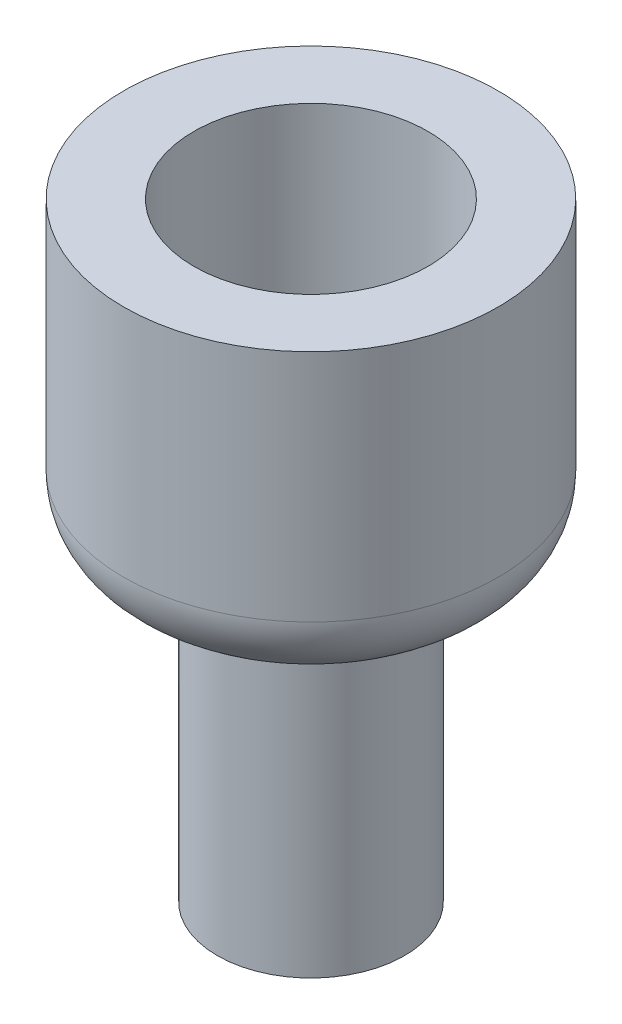
ISO-10303-21;
HEADER;
FILE_DESCRIPTION(('STEP AP214'),'2;1');
FILE_NAME('part.step','',(''),(''),'','','');
FILE_SCHEMA(('AUTOMOTIVE_DESIGN { 1 0 10303 214 1 1 1 1 }'));
ENDSEC;
DATA;
#1=APPLICATION_CONTEXT('core data for automotive mechanical design processes');
#2=APPLICATION_PROTOCOL_DEFINITION('international standard','automotive_design',2000,#1);
#3=PRODUCT_CONTEXT('',#1,'mechanical');
#4=PRODUCT('Part','Part','',(#3));
#5=PRODUCT_RELATED_PRODUCT_CATEGORY('part','',(#4));
#6=PRODUCT_DEFINITION_FORMATION('','',#4);
#7=PRODUCT_DEFINITION_CONTEXT('part definition',#1,'design');
#8=PRODUCT_DEFINITION('design','',#6,#7);
#9=PRODUCT_DEFINITION_SHAPE('','',#8);
#10=(LENGTH_UNIT() NAMED_UNIT(*) SI_UNIT(.MILLI.,.METRE.));
#11=(NAMED_UNIT(*) PLANE_ANGLE_UNIT() SI_UNIT($,.RADIAN.));
#12=(NAMED_UNIT(*) SI_UNIT($,.STERADIAN.) SOLID_ANGLE_UNIT());
#13=UNCERTAINTY_MEASURE_WITH_UNIT(LENGTH_MEASURE(1.E-05),#10,'distance_accuracy_value','');
#14=(GEOMETRIC_REPRESENTATION_CONTEXT(3) GLOBAL_UNCERTAINTY_ASSIGNED_CONTEXT((#13)) GLOBAL_UNIT_ASSIGNED_CONTEXT((#10,
#11,#12)) REPRESENTATION_CONTEXT('',''));
#15=CARTESIAN_POINT('',(0.,0.,0.));
#16=DIRECTION('',(0.,0.,1.));
#17=DIRECTION('',(1.,0.,0.));
#18=AXIS2_PLACEMENT_3D('',#15,#16,#17);
#19=CARTESIAN_POINT('',(0.,0.,0.));
#20=DIRECTION('',(0.,1.,0.));
#21=DIRECTION('',(0.,0.,1.));
#22=AXIS2_PLACEMENT_3D('',#19,#20,#21);
#23=CYLINDRICAL_SURFACE('',#22,2.);
#24=CARTESIAN_POINT('',(0.,-6.5,0.));
#25=DIRECTION('',(0.,1.,0.));
#26=DIRECTION('',(0.,0.,1.));
#27=AXIS2_PLACEMENT_3D('',#24,#25,#26);
#28=CIRCLE('',#27,2.);
#29=CARTESIAN_POINT('',(0.,-6.5,2.));
#30=VERTEX_POINT('',#29);
#31=EDGE_CURVE('E10',#30,#30,#28,.T.);
#32=ORIENTED_EDGE('',*,*,#31,.T.);
#33=EDGE_LOOP('',(#32));
#34=FACE_BOUND('',#33,.T.);
#35=CARTESIAN_POINT('',(0.,0.,0.));
#36=DIRECTION('',(0.,1.,0.));
#37=DIRECTION('',(0.,0.,1.));
#38=AXIS2_PLACEMENT_3D('',#35,#36,#37);
#39=CIRCLE('',#38,2.);
#40=CARTESIAN_POINT('',(0.,0.,2.));
#41=VERTEX_POINT('',#40);
#42=EDGE_CURVE('E65',#41,#41,#39,.T.);
#43=ORIENTED_EDGE('',*,*,#42,.F.);
#44=EDGE_LOOP('',(#43));
#45=FACE_BOUND('',#44,.T.);
#46=ADVANCED_FACE('F34',(#34,#45),#23,.T.);
#47=CARTESIAN_POINT('',(-2.,-6.5,0.));
#48=DIRECTION('',(0.,-1.,0.));
#49=DIRECTION('',(0.,0.,-1.));
#50=AXIS2_PLACEMENT_3D('',#47,#48,#49);
#51=PLANE('',#50);
#52=CARTESIAN_POINT('',(0.,-6.5,0.));
#53=DIRECTION('',(0.,1.,0.));
#54=DIRECTION('',(0.,0.,1.));
#55=AXIS2_PLACEMENT_3D('',#52,#53,#54);
#56=CIRCLE('',#55,0.749999999999999);
#57=CARTESIAN_POINT('',(0.,-6.5,0.749999999999999));
#58=VERTEX_POINT('',#57);
#59=EDGE_CURVE('E40',#58,#58,#56,.T.);
#60=ORIENTED_EDGE('',*,*,#59,.T.);
#61=EDGE_LOOP('',(#60));
#62=FACE_BOUND('',#61,.T.);
#63=ORIENTED_EDGE('',*,*,#31,.F.);
#64=EDGE_LOOP('',(#63));
#65=FACE_BOUND('',#64,.T.);
#66=ADVANCED_FACE('F73',(#62,#65),#51,.T.);
#67=CARTESIAN_POINT('',(0.,0.,0.));
#68=DIRECTION('',(0.,1.,0.));
#69=DIRECTION('',(0.,0.,1.));
#70=AXIS2_PLACEMENT_3D('',#67,#68,#69);
#71=CYLINDRICAL_SURFACE('',#70,0.749999999999999);
#72=CARTESIAN_POINT('',(0.,1.5,0.));
#73=DIRECTION('',(0.,1.,0.));
#74=DIRECTION('',(0.,0.,1.));
#75=AXIS2_PLACEMENT_3D('',#72,#73,#74);
#76=CIRCLE('',#75,0.749999999999999);
#77=CARTESIAN_POINT('',(0.,1.5,0.749999999999999));
#78=VERTEX_POINT('',#77);
#79=EDGE_CURVE('E44',#78,#78,#76,.T.);
#80=ORIENTED_EDGE('',*,*,#79,.T.);
#81=EDGE_LOOP('',(#80));
#82=FACE_BOUND('',#81,.T.);
#83=ORIENTED_EDGE('',*,*,#59,.F.);
#84=EDGE_LOOP('',(#83));
#85=FACE_BOUND('',#84,.T.);
#86=ADVANCED_FACE('F77',(#82,#85),#71,.F.);
#87=CARTESIAN_POINT('',(0.,1.5,0.));
#88=DIRECTION('',(0.,1.,0.));
#89=DIRECTION('',(0.,0.,1.));
#90=AXIS2_PLACEMENT_3D('',#87,#88,#89);
#91=CONICAL_SURFACE('',#90,0.749999999999999,1.0471975511966);
#92=CARTESIAN_POINT('',(0.,2.51036297108185,0.));
#93=DIRECTION('',(0.,1.,0.));
#94=DIRECTION('',(0.,0.,1.));
#95=AXIS2_PLACEMENT_3D('',#92,#93,#94);
#96=CIRCLE('',#95,2.5);
#97=CARTESIAN_POINT('',(0.,2.51036297108185,2.5));
#98=VERTEX_POINT('',#97);
#99=EDGE_CURVE('E48',#98,#98,#96,.T.);
#100=CARTESIAN_POINT('',(0.,2.51036297108185,2.5));
#101=CARTESIAN_POINT('',(0.,2.49983835679974,2.48177083333333));
#102=CARTESIAN_POINT('',(0.,2.48931374251764,2.46354166666667));
#103=CARTESIAN_POINT('',(0.,2.46826451395344,2.42708333333333));
#104=CARTESIAN_POINT('',(0.,2.45773989967133,2.40885416666667));
#105=CARTESIAN_POINT('',(0.,2.43669067110713,2.37239583333333));
#106=CARTESIAN_POINT('',(0.,2.42616605682503,2.35416666666667));
#107=CARTESIAN_POINT('',(0.,2.40511682826082,2.31770833333333));
#108=CARTESIAN_POINT('',(0.,2.39459221397872,2.29947916666667));
#109=CARTESIAN_POINT('',(0.,2.37354298541451,2.26302083333333));
#110=CARTESIAN_POINT('',(0.,2.36301837113241,2.24479166666667));
#111=CARTESIAN_POINT('',(0.,2.34196914256821,2.20833333333333));
#112=CARTESIAN_POINT('',(0.,2.3314445282861,2.19010416666667));
#113=CARTESIAN_POINT('',(0.,2.3103952997219,2.15364583333333));
#114=CARTESIAN_POINT('',(0.,2.2998706854398,2.13541666666667));
#115=CARTESIAN_POINT('',(0.,2.27882145687559,2.09895833333333));
#116=CARTESIAN_POINT('',(0.,2.26829684259349,2.08072916666667));
#117=CARTESIAN_POINT('',(0.,2.24724761402928,2.04427083333333));
#118=CARTESIAN_POINT('',(0.,2.23672299974718,2.02604166666667));
#119=CARTESIAN_POINT('',(0.,2.21567377118297,1.98958333333333));
#120=CARTESIAN_POINT('',(0.,2.20514915690087,1.97135416666667));
#121=CARTESIAN_POINT('',(0.,2.18409992833667,1.93489583333333));
#122=CARTESIAN_POINT('',(0.,2.17357531405456,1.91666666666667));
#123=CARTESIAN_POINT('',(0.,2.15252608549036,1.88020833333333));
#124=CARTESIAN_POINT('',(0.,2.14200147120826,1.86197916666667));
#125=CARTESIAN_POINT('',(0.,2.12095224264405,1.82552083333333));
#126=CARTESIAN_POINT('',(0.,2.11042762836195,1.80729166666667));
#127=CARTESIAN_POINT('',(0.,2.08937839979774,1.77083333333333));
#128=CARTESIAN_POINT('',(0.,2.07885378551564,1.75260416666667));
#129=CARTESIAN_POINT('',(0.,2.05780455695144,1.71614583333333));
#130=CARTESIAN_POINT('',(0.,2.04727994266933,1.69791666666667));
#131=CARTESIAN_POINT('',(0.,2.02623071410513,1.66145833333333));
#132=CARTESIAN_POINT('',(0.,2.01570609982303,1.64322916666667));
#133=CARTESIAN_POINT('',(0.,1.99465687125882,1.60677083333333));
#134=CARTESIAN_POINT('',(0.,1.98413225697672,1.58854166666667));
#135=CARTESIAN_POINT('',(0.,1.96308302841251,1.55208333333333));
#136=CARTESIAN_POINT('',(0.,1.95255841413041,1.53385416666667));
#137=CARTESIAN_POINT('',(0.,1.9315091855662,1.49739583333333));
#138=CARTESIAN_POINT('',(0.,1.9209845712841,1.47916666666667));
#139=CARTESIAN_POINT('',(0.,1.8999353427199,1.44270833333333));
#140=CARTESIAN_POINT('',(0.,1.88941072843779,1.42447916666667));
#141=CARTESIAN_POINT('',(0.,1.86836149987359,1.38802083333333));
#142=CARTESIAN_POINT('',(0.,1.85783688559149,1.36979166666667));
#143=CARTESIAN_POINT('',(0.,1.83678765702728,1.33333333333333));
#144=CARTESIAN_POINT('',(0.,1.82626304274518,1.31510416666667));
#145=CARTESIAN_POINT('',(0.,1.80521381418097,1.27864583333333));
#146=CARTESIAN_POINT('',(0.,1.79468919989887,1.26041666666667));
#147=CARTESIAN_POINT('',(0.,1.77363997133467,1.22395833333333));
#148=CARTESIAN_POINT('',(0.,1.76311535705256,1.20572916666667));
#149=CARTESIAN_POINT('',(0.,1.74206612848836,1.16927083333333));
#150=CARTESIAN_POINT('',(0.,1.73154151420626,1.15104166666667));
#151=CARTESIAN_POINT('',(0.,1.71049228564205,1.11458333333333));
#152=CARTESIAN_POINT('',(0.,1.69996767135995,1.09635416666667));
#153=CARTESIAN_POINT('',(0.,1.67891844279574,1.05989583333333));
#154=CARTESIAN_POINT('',(0.,1.66839382851364,1.04166666666667));
#155=CARTESIAN_POINT('',(0.,1.64734459994944,1.00520833333333));
#156=CARTESIAN_POINT('',(0.,1.63681998566733,0.986979166666666));
#157=CARTESIAN_POINT('',(0.,1.61577075710313,0.950520833333333));
#158=CARTESIAN_POINT('',(0.,1.60524614282102,0.932291666666666));
#159=CARTESIAN_POINT('',(0.,1.58419691425682,0.895833333333333));
#160=CARTESIAN_POINT('',(0.,1.57367229997472,0.877604166666666));
#161=CARTESIAN_POINT('',(0.,1.55262307141051,0.841145833333333));
#162=CARTESIAN_POINT('',(0.,1.54209845712841,0.822916666666666));
#163=CARTESIAN_POINT('',(0.,1.5210492285642,0.786458333333333));
#164=CARTESIAN_POINT('',(0.,1.5105246142821,0.768229166666666));
#165=CARTESIAN_POINT('',(0.,1.5,0.749999999999999));
#166=B_SPLINE_CURVE_WITH_KNOTS('',3,(#100,#101,#102,#103,#104,#105,#106,#107,#108,#109,#110,
#111,#112,#113,#114,#115,#116,#117,#118,#119,#120,#121,#122,#123,#124,#125,#126,#127,#128,#129,
#130,#131,#132,#133,#134,#135,#136,#137,#138,#139,#140,#141,#142,#143,#144,#145,#146,#147,#148,
#149,#150,#151,#152,#153,#154,#155,#156,#157,#158,#159,#160,#161,#162,#163,#164,#165),
.UNSPECIFIED.,.F.,.F.,(4,2,2,2,2,2,2,2,2,2,2,2,2,2,2,2,2,2,2,2,2,2,2,2,2,2,2,2,2,2,2,2,4),(0.,
0.0631476856926155,0.126295371385231,0.189443057077846,0.252590742770462,0.315738428463077,
0.378886114155692,0.442033799848308,0.505181485540923,0.568329171233538,0.631476856926154,
0.694624542618769,0.757772228311384,0.820919914004,0.884067599696615,0.94721528538923,
1.01036297108185,1.07351065677446,1.13665834246708,1.19980602815969,1.26295371385231,
1.32610139954492,1.38924908523754,1.45239677093015,1.51554445662277,1.57869214231538,
1.641839828008,1.70498751370062,1.76813519939323,1.83128288508585,1.89443057077846,
1.95757825647108,2.02072594216369),.UNSPECIFIED.);
#167=EDGE_CURVE('BSEAM81',#98,#78,#166,.T.);
#168=ORIENTED_EDGE('',*,*,#99,.T.);
#169=ORIENTED_EDGE('',*,*,#79,.F.);
#170=ORIENTED_EDGE('',*,*,#167,.T.);
#171=ORIENTED_EDGE('',*,*,#167,.F.);
#172=EDGE_LOOP('',(#168,#170,#169,#171));
#173=FACE_BOUND('',#172,.T.);
#174=ADVANCED_FACE('F81',(#173),#91,.F.);
#175=CARTESIAN_POINT('',(0.,0.,0.));
#176=DIRECTION('',(0.,1.,0.));
#177=DIRECTION('',(0.,0.,1.));
#178=AXIS2_PLACEMENT_3D('',#175,#176,#177);
#179=CYLINDRICAL_SURFACE('',#178,2.5);
#180=CARTESIAN_POINT('',(0.,6.5,0.));
#181=DIRECTION('',(0.,1.,0.));
#182=DIRECTION('',(0.,0.,1.));
#183=AXIS2_PLACEMENT_3D('',#180,#181,#182);
#184=CIRCLE('',#183,2.5);
#185=CARTESIAN_POINT('',(0.,6.5,2.5));
#186=VERTEX_POINT('',#185);
#187=EDGE_CURVE('E53',#186,#186,#184,.T.);
#188=ORIENTED_EDGE('',*,*,#187,.T.);
#189=EDGE_LOOP('',(#188));
#190=FACE_BOUND('',#189,.T.);
#191=ORIENTED_EDGE('',*,*,#99,.F.);
#192=EDGE_LOOP('',(#191));
#193=FACE_BOUND('',#192,.T.);
#194=ADVANCED_FACE('F88',(#190,#193),#179,.F.);
#195=CARTESIAN_POINT('',(-2.5,6.5,0.));
#196=DIRECTION('',(0.,1.,0.));
#197=DIRECTION('',(0.,0.,1.));
#198=AXIS2_PLACEMENT_3D('',#195,#196,#197);
#199=PLANE('',#198);
#200=CARTESIAN_POINT('',(0.,6.5,0.));
#201=DIRECTION('',(0.,1.,0.));
#202=DIRECTION('',(0.,0.,1.));
#203=AXIS2_PLACEMENT_3D('',#200,#201,#202);
#204=CIRCLE('',#203,4.);
#205=CARTESIAN_POINT('',(0.,6.5,4.));
#206=VERTEX_POINT('',#205);
#207=EDGE_CURVE('E56',#206,#206,#204,.T.);
#208=ORIENTED_EDGE('',*,*,#207,.T.);
#209=EDGE_LOOP('',(#208));
#210=FACE_BOUND('',#209,.T.);
#211=ORIENTED_EDGE('',*,*,#187,.F.);
#212=EDGE_LOOP('',(#211));
#213=FACE_BOUND('',#212,.T.);
#214=ADVANCED_FACE('F92',(#210,#213),#199,.T.);
#215=CARTESIAN_POINT('',(0.,0.,0.));
#216=DIRECTION('',(0.,1.,0.));
#217=DIRECTION('',(0.,0.,1.));
#218=AXIS2_PLACEMENT_3D('',#215,#216,#217);
#219=CYLINDRICAL_SURFACE('',#218,4.);
#220=CARTESIAN_POINT('',(0.,1.5,0.));
#221=DIRECTION('',(0.,1.,0.));
#222=DIRECTION('',(0.,0.,1.));
#223=AXIS2_PLACEMENT_3D('',#220,#221,#222);
#224=CIRCLE('',#223,4.);
#225=CARTESIAN_POINT('',(0.,1.5,4.));
#226=VERTEX_POINT('',#225);
#227=EDGE_CURVE('E59',#226,#226,#224,.T.);
#228=ORIENTED_EDGE('',*,*,#227,.T.);
#229=EDGE_LOOP('',(#228));
#230=FACE_BOUND('',#229,.T.);
#231=ORIENTED_EDGE('',*,*,#207,.F.);
#232=EDGE_LOOP('',(#231));
#233=FACE_BOUND('',#232,.T.);
#234=ADVANCED_FACE('F96',(#230,#233),#219,.T.);
#235=CARTESIAN_POINT('',(0.,1.5,0.));
#236=DIRECTION('',(0.,1.,0.));
#237=DIRECTION('',(0.,0.,1.));
#238=AXIS2_PLACEMENT_3D('',#235,#236,#237);
#239=TOROIDAL_SURFACE('',#238,2.5,1.5);
#240=CARTESIAN_POINT('',(0.,0.,0.));
#241=DIRECTION('',(0.,1.,0.));
#242=DIRECTION('',(0.,0.,1.));
#243=AXIS2_PLACEMENT_3D('',#240,#241,#242);
#244=CIRCLE('',#243,2.5);
#245=CARTESIAN_POINT('',(0.,0.,2.5));
#246=VERTEX_POINT('',#245);
#247=EDGE_CURVE('E62',#246,#246,#244,.T.);
#248=ORIENTED_EDGE('',*,*,#247,.T.);
#249=EDGE_LOOP('',(#248));
#250=FACE_BOUND('',#249,.T.);
#251=ORIENTED_EDGE('',*,*,#227,.F.);
#252=EDGE_LOOP('',(#251));
#253=FACE_BOUND('',#252,.T.);
#254=ADVANCED_FACE('F100',(#250,#253),#239,.T.);
#255=CARTESIAN_POINT('',(-2.5,0.,0.));
#256=DIRECTION('',(0.,-1.,0.));
#257=DIRECTION('',(0.,0.,-1.));
#258=AXIS2_PLACEMENT_3D('',#255,#256,#257);
#259=PLANE('',#258);
#260=ORIENTED_EDGE('',*,*,#42,.T.);
#261=EDGE_LOOP('',(#260));
#262=FACE_BOUND('',#261,.T.);
#263=ORIENTED_EDGE('',*,*,#247,.F.);
#264=EDGE_LOOP('',(#263));
#265=FACE_BOUND('',#264,.T.);
#266=ADVANCED_FACE('F69',(#262,#265),#259,.T.);
#267=CLOSED_SHELL('',(#46,#66,#86,#174,#194,#214,#234,#254,#266));
#268=MANIFOLD_SOLID_BREP('B2',#267);
#269=ADVANCED_BREP_SHAPE_REPRESENTATION('',(#18,#268),#14);
#270=SHAPE_DEFINITION_REPRESENTATION(#9,#269);
ENDSEC;
END-ISO-10303-21;
